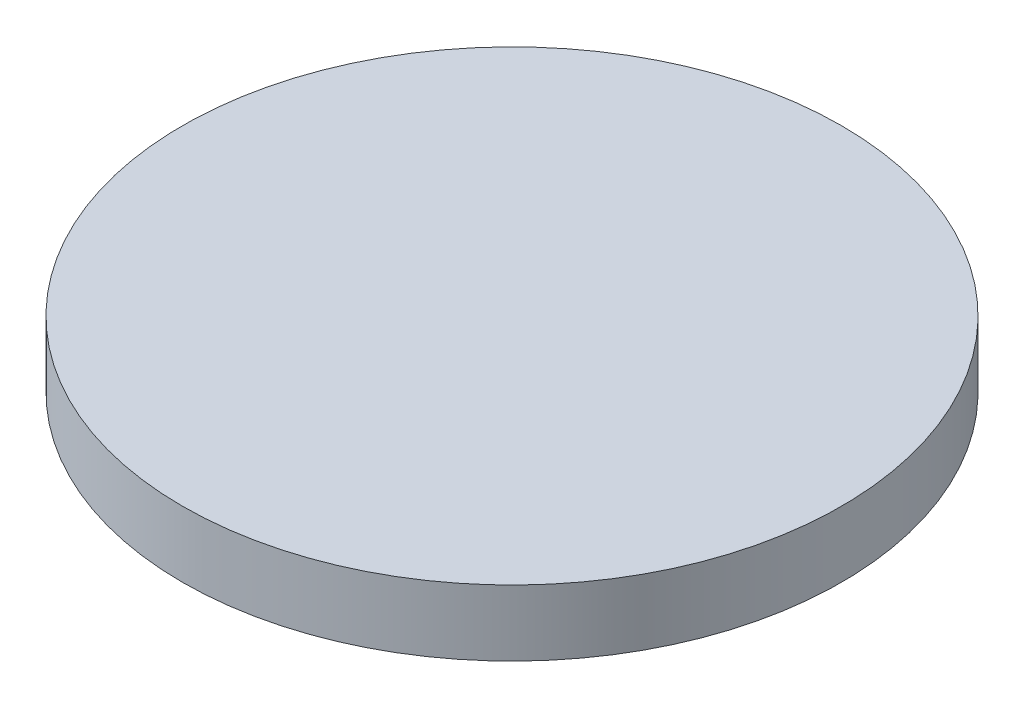
ISO-10303-21;
HEADER;
FILE_DESCRIPTION(('STEP AP214'),'2;1');
FILE_NAME('part.step','',(''),(''),'','','');
FILE_SCHEMA(('AUTOMOTIVE_DESIGN { 1 0 10303 214 1 1 1 1 }'));
ENDSEC;
DATA;
#1=APPLICATION_CONTEXT('core data for automotive mechanical design processes');
#2=APPLICATION_PROTOCOL_DEFINITION('international standard','automotive_design',2000,#1);
#3=PRODUCT_CONTEXT('',#1,'mechanical');
#4=PRODUCT('Part','Part','',(#3));
#5=PRODUCT_RELATED_PRODUCT_CATEGORY('part','',(#4));
#6=PRODUCT_DEFINITION_FORMATION('','',#4);
#7=PRODUCT_DEFINITION_CONTEXT('part definition',#1,'design');
#8=PRODUCT_DEFINITION('design','',#6,#7);
#9=PRODUCT_DEFINITION_SHAPE('','',#8);
#10=(LENGTH_UNIT() NAMED_UNIT(*) SI_UNIT(.MILLI.,.METRE.));
#11=(NAMED_UNIT(*) PLANE_ANGLE_UNIT() SI_UNIT($,.RADIAN.));
#12=(NAMED_UNIT(*) SI_UNIT($,.STERADIAN.) SOLID_ANGLE_UNIT());
#13=UNCERTAINTY_MEASURE_WITH_UNIT(LENGTH_MEASURE(1.E-05),#10,'distance_accuracy_value','');
#14=(GEOMETRIC_REPRESENTATION_CONTEXT(3) GLOBAL_UNCERTAINTY_ASSIGNED_CONTEXT((#13)) GLOBAL_UNIT_ASSIGNED_CONTEXT((#10,
#11,#12)) REPRESENTATION_CONTEXT('',''));
#15=CARTESIAN_POINT('',(0.,0.,0.));
#16=DIRECTION('',(0.,0.,1.));
#17=DIRECTION('',(1.,0.,0.));
#18=AXIS2_PLACEMENT_3D('',#15,#16,#17);
#19=CARTESIAN_POINT('',(0.,0.05,0.));
#20=DIRECTION('',(0.,-1.,0.));
#21=DIRECTION('',(0.,0.,-1.));
#22=AXIS2_PLACEMENT_3D('',#19,#20,#21);
#23=CYLINDRICAL_SURFACE('',#22,0.25);
#24=CARTESIAN_POINT('',(0.,0.05,0.));
#25=DIRECTION('',(0.,1.,0.));
#26=DIRECTION('',(0.,0.,1.));
#27=AXIS2_PLACEMENT_3D('',#24,#25,#26);
#28=CIRCLE('',#27,0.25);
#29=CARTESIAN_POINT('',(0.,0.05,0.25));
#30=VERTEX_POINT('',#29);
#31=EDGE_CURVE('E10',#30,#30,#28,.T.);
#32=ORIENTED_EDGE('',*,*,#31,.F.);
#33=EDGE_LOOP('',(#32));
#34=FACE_BOUND('',#33,.T.);
#35=CARTESIAN_POINT('',(0.,0.,0.));
#36=DIRECTION('',(0.,1.,0.));
#37=DIRECTION('',(0.,0.,1.));
#38=AXIS2_PLACEMENT_3D('',#35,#36,#37);
#39=CIRCLE('',#38,0.25);
#40=CARTESIAN_POINT('',(0.,0.,0.25));
#41=VERTEX_POINT('',#40);
#42=EDGE_CURVE('E38',#41,#41,#39,.T.);
#43=ORIENTED_EDGE('',*,*,#42,.T.);
#44=EDGE_LOOP('',(#43));
#45=FACE_BOUND('',#44,.T.);
#46=ADVANCED_FACE('F35',(#34,#45),#23,.T.);
#47=CARTESIAN_POINT('',(0.,0.05,0.));
#48=DIRECTION('',(0.,1.,0.));
#49=DIRECTION('',(0.,0.,1.));
#50=AXIS2_PLACEMENT_3D('',#47,#48,#49);
#51=PLANE('',#50);
#52=ORIENTED_EDGE('',*,*,#31,.T.);
#53=EDGE_LOOP('',(#52));
#54=FACE_BOUND('',#53,.T.);
#55=ADVANCED_FACE('F50',(#54),#51,.T.);
#56=CARTESIAN_POINT('',(0.,0.,0.));
#57=DIRECTION('',(0.,1.,0.));
#58=DIRECTION('',(0.,0.,1.));
#59=AXIS2_PLACEMENT_3D('',#56,#57,#58);
#60=PLANE('',#59);
#61=ORIENTED_EDGE('',*,*,#42,.F.);
#62=EDGE_LOOP('',(#61));
#63=FACE_BOUND('',#62,.T.);
#64=ADVANCED_FACE('F48',(#63),#60,.F.);
#65=CLOSED_SHELL('',(#46,#55,#64));
#66=MANIFOLD_SOLID_BREP('B2',#65);
#67=ADVANCED_BREP_SHAPE_REPRESENTATION('',(#18,#66),#14);
#68=SHAPE_DEFINITION_REPRESENTATION(#9,#67);
ENDSEC;
END-ISO-10303-21;
